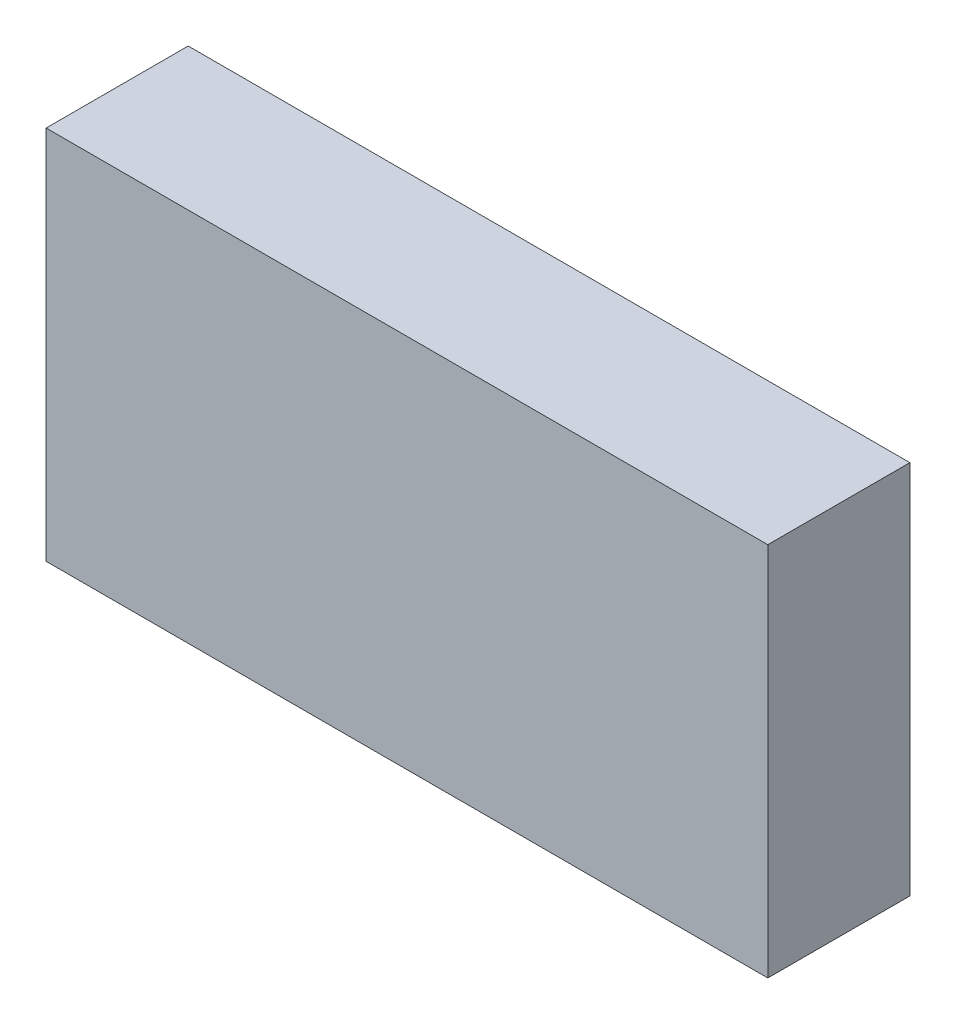
ISO-10303-21;
HEADER;
FILE_DESCRIPTION(('STEP AP214'),'2;1');
FILE_NAME('part.step','',(''),(''),'','','');
FILE_SCHEMA(('AUTOMOTIVE_DESIGN { 1 0 10303 214 1 1 1 1 }'));
ENDSEC;
DATA;
#1=APPLICATION_CONTEXT('core data for automotive mechanical design processes');
#2=APPLICATION_PROTOCOL_DEFINITION('international standard','automotive_design',2000,#1);
#3=PRODUCT_CONTEXT('',#1,'mechanical');
#4=PRODUCT('Part','Part','',(#3));
#5=PRODUCT_RELATED_PRODUCT_CATEGORY('part','',(#4));
#6=PRODUCT_DEFINITION_FORMATION('','',#4);
#7=PRODUCT_DEFINITION_CONTEXT('part definition',#1,'design');
#8=PRODUCT_DEFINITION('design','',#6,#7);
#9=PRODUCT_DEFINITION_SHAPE('','',#8);
#10=(LENGTH_UNIT() NAMED_UNIT(*) SI_UNIT(.MILLI.,.METRE.));
#11=(NAMED_UNIT(*) PLANE_ANGLE_UNIT() SI_UNIT($,.RADIAN.));
#12=(NAMED_UNIT(*) SI_UNIT($,.STERADIAN.) SOLID_ANGLE_UNIT());
#13=UNCERTAINTY_MEASURE_WITH_UNIT(LENGTH_MEASURE(1.E-05),#10,'distance_accuracy_value','');
#14=(GEOMETRIC_REPRESENTATION_CONTEXT(3) GLOBAL_UNCERTAINTY_ASSIGNED_CONTEXT((#13)) GLOBAL_UNIT_ASSIGNED_CONTEXT((#10,
#11,#12)) REPRESENTATION_CONTEXT('',''));
#15=CARTESIAN_POINT('',(0.,0.,0.));
#16=DIRECTION('',(0.,0.,1.));
#17=DIRECTION('',(1.,0.,0.));
#18=AXIS2_PLACEMENT_3D('',#15,#16,#17);
#19=CARTESIAN_POINT('',(-1.27,-1.27,1.));
#20=DIRECTION('',(1.,0.,0.));
#21=DIRECTION('',(0.,0.,-1.));
#22=AXIS2_PLACEMENT_3D('',#19,#20,#21);
#23=PLANE('',#22);
#24=DIRECTION('',(0.,-1.,0.));
#25=VECTOR('',#24,1.);
#26=CARTESIAN_POINT('',(-1.27,-1.27,0.));
#27=LINE('',#26,#25);
#28=CARTESIAN_POINT('',(-1.27,1.3716,0.));
#29=VERTEX_POINT('',#28);
#30=CARTESIAN_POINT('',(-1.27,-1.27,0.));
#31=VERTEX_POINT('',#30);
#32=EDGE_CURVE('E95',#29,#31,#27,.T.);
#33=ORIENTED_EDGE('',*,*,#32,.T.);
#34=DIRECTION('',(0.,0.,-1.));
#35=VECTOR('',#34,1.);
#36=CARTESIAN_POINT('',(-1.27,-1.27,1.));
#37=LINE('',#36,#35);
#38=CARTESIAN_POINT('',(-1.27,-1.27,1.));
#39=VERTEX_POINT('',#38);
#40=EDGE_CURVE('E11',#39,#31,#37,.T.);
#41=ORIENTED_EDGE('',*,*,#40,.F.);
#42=DIRECTION('',(0.,-1.,0.));
#43=VECTOR('',#42,1.);
#44=CARTESIAN_POINT('',(-1.27,-1.27,1.));
#45=LINE('',#44,#43);
#46=CARTESIAN_POINT('',(-1.27,1.3716,1.));
#47=VERTEX_POINT('',#46);
#48=EDGE_CURVE('E83',#47,#39,#45,.T.);
#49=ORIENTED_EDGE('',*,*,#48,.F.);
#50=DIRECTION('',(0.,0.,-1.));
#51=VECTOR('',#50,1.);
#52=CARTESIAN_POINT('',(-1.27,1.3716,1.));
#53=LINE('',#52,#51);
#54=EDGE_CURVE('E91',#47,#29,#53,.T.);
#55=ORIENTED_EDGE('',*,*,#54,.T.);
#56=EDGE_LOOP('',(#33,#41,#49,#55));
#57=FACE_BOUND('',#56,.T.);
#58=ADVANCED_FACE('F32',(#57),#23,.F.);
#59=CARTESIAN_POINT('',(3.81,-1.27,1.));
#60=DIRECTION('',(0.,1.,0.));
#61=DIRECTION('',(0.,0.,1.));
#62=AXIS2_PLACEMENT_3D('',#59,#60,#61);
#63=PLANE('',#62);
#64=DIRECTION('',(1.,0.,0.));
#65=VECTOR('',#64,1.);
#66=CARTESIAN_POINT('',(3.81,-1.27,0.));
#67=LINE('',#66,#65);
#68=CARTESIAN_POINT('',(3.81,-1.27,0.));
#69=VERTEX_POINT('',#68);
#70=EDGE_CURVE('E87',#31,#69,#67,.T.);
#71=ORIENTED_EDGE('',*,*,#70,.T.);
#72=DIRECTION('',(0.,0.,-1.));
#73=VECTOR('',#72,1.);
#74=CARTESIAN_POINT('',(3.81,-1.27,1.));
#75=LINE('',#74,#73);
#76=CARTESIAN_POINT('',(3.81,-1.27,1.));
#77=VERTEX_POINT('',#76);
#78=EDGE_CURVE('E40',#77,#69,#75,.T.);
#79=ORIENTED_EDGE('',*,*,#78,.F.);
#80=DIRECTION('',(1.,0.,0.));
#81=VECTOR('',#80,1.);
#82=CARTESIAN_POINT('',(3.81,-1.27,1.));
#83=LINE('',#82,#81);
#84=EDGE_CURVE('E78',#39,#77,#83,.T.);
#85=ORIENTED_EDGE('',*,*,#84,.F.);
#86=ORIENTED_EDGE('',*,*,#40,.T.);
#87=EDGE_LOOP('',(#71,#79,#85,#86));
#88=FACE_BOUND('',#87,.T.);
#89=ADVANCED_FACE('F86',(#88),#63,.F.);
#90=CARTESIAN_POINT('',(3.81,1.3716,1.));
#91=DIRECTION('',(-1.,0.,0.));
#92=DIRECTION('',(0.,0.,1.));
#93=AXIS2_PLACEMENT_3D('',#90,#91,#92);
#94=PLANE('',#93);
#95=DIRECTION('',(0.,1.,0.));
#96=VECTOR('',#95,1.);
#97=CARTESIAN_POINT('',(3.81,1.3716,0.));
#98=LINE('',#97,#96);
#99=CARTESIAN_POINT('',(3.81,1.3716,0.));
#100=VERTEX_POINT('',#99);
#101=EDGE_CURVE('E65',#69,#100,#98,.T.);
#102=ORIENTED_EDGE('',*,*,#101,.T.);
#103=DIRECTION('',(0.,0.,-1.));
#104=VECTOR('',#103,1.);
#105=CARTESIAN_POINT('',(3.81,1.3716,1.));
#106=LINE('',#105,#104);
#107=CARTESIAN_POINT('',(3.81,1.3716,1.));
#108=VERTEX_POINT('',#107);
#109=EDGE_CURVE('E88',#108,#100,#106,.T.);
#110=ORIENTED_EDGE('',*,*,#109,.F.);
#111=DIRECTION('',(0.,1.,0.));
#112=VECTOR('',#111,1.);
#113=CARTESIAN_POINT('',(3.81,1.3716,1.));
#114=LINE('',#113,#112);
#115=EDGE_CURVE('E81',#77,#108,#114,.T.);
#116=ORIENTED_EDGE('',*,*,#115,.F.);
#117=ORIENTED_EDGE('',*,*,#78,.T.);
#118=EDGE_LOOP('',(#102,#110,#116,#117));
#119=FACE_BOUND('',#118,.T.);
#120=ADVANCED_FACE('F89',(#119),#94,.F.);
#121=CARTESIAN_POINT('',(-1.27,1.3716,1.));
#122=DIRECTION('',(0.,-1.,0.));
#123=DIRECTION('',(0.,0.,-1.));
#124=AXIS2_PLACEMENT_3D('',#121,#122,#123);
#125=PLANE('',#124);
#126=DIRECTION('',(-1.,0.,0.));
#127=VECTOR('',#126,1.);
#128=CARTESIAN_POINT('',(-1.27,1.3716,0.));
#129=LINE('',#128,#127);
#130=EDGE_CURVE('E71',#100,#29,#129,.T.);
#131=ORIENTED_EDGE('',*,*,#130,.T.);
#132=ORIENTED_EDGE('',*,*,#54,.F.);
#133=DIRECTION('',(-1.,0.,0.));
#134=VECTOR('',#133,1.);
#135=CARTESIAN_POINT('',(-1.27,1.3716,1.));
#136=LINE('',#135,#134);
#137=EDGE_CURVE('E48',#108,#47,#136,.T.);
#138=ORIENTED_EDGE('',*,*,#137,.F.);
#139=ORIENTED_EDGE('',*,*,#109,.T.);
#140=EDGE_LOOP('',(#131,#132,#138,#139));
#141=FACE_BOUND('',#140,.T.);
#142=ADVANCED_FACE('F102',(#141),#125,.F.);
#143=CARTESIAN_POINT('',(0.,0.,1.));
#144=DIRECTION('',(0.,0.,-1.));
#145=DIRECTION('',(-1.,0.,0.));
#146=AXIS2_PLACEMENT_3D('',#143,#144,#145);
#147=PLANE('',#146);
#148=ORIENTED_EDGE('',*,*,#48,.T.);
#149=ORIENTED_EDGE('',*,*,#84,.T.);
#150=ORIENTED_EDGE('',*,*,#115,.T.);
#151=ORIENTED_EDGE('',*,*,#137,.T.);
#152=EDGE_LOOP('',(#148,#149,#150,#151));
#153=FACE_BOUND('',#152,.T.);
#154=ADVANCED_FACE('F79',(#153),#147,.F.);
#155=CARTESIAN_POINT('',(0.,0.,0.));
#156=DIRECTION('',(0.,0.,-1.));
#157=DIRECTION('',(-1.,0.,0.));
#158=AXIS2_PLACEMENT_3D('',#155,#156,#157);
#159=PLANE('',#158);
#160=ORIENTED_EDGE('',*,*,#32,.F.);
#161=ORIENTED_EDGE('',*,*,#130,.F.);
#162=ORIENTED_EDGE('',*,*,#101,.F.);
#163=ORIENTED_EDGE('',*,*,#70,.F.);
#164=EDGE_LOOP('',(#160,#161,#162,#163));
#165=FACE_BOUND('',#164,.T.);
#166=ADVANCED_FACE('F105',(#165),#159,.T.);
#167=CLOSED_SHELL('',(#58,#89,#120,#142,#154,#166));
#168=MANIFOLD_SOLID_BREP('B2',#167);
#169=ADVANCED_BREP_SHAPE_REPRESENTATION('',(#18,#168),#14);
#170=SHAPE_DEFINITION_REPRESENTATION(#9,#169);
ENDSEC;
END-ISO-10303-21;
